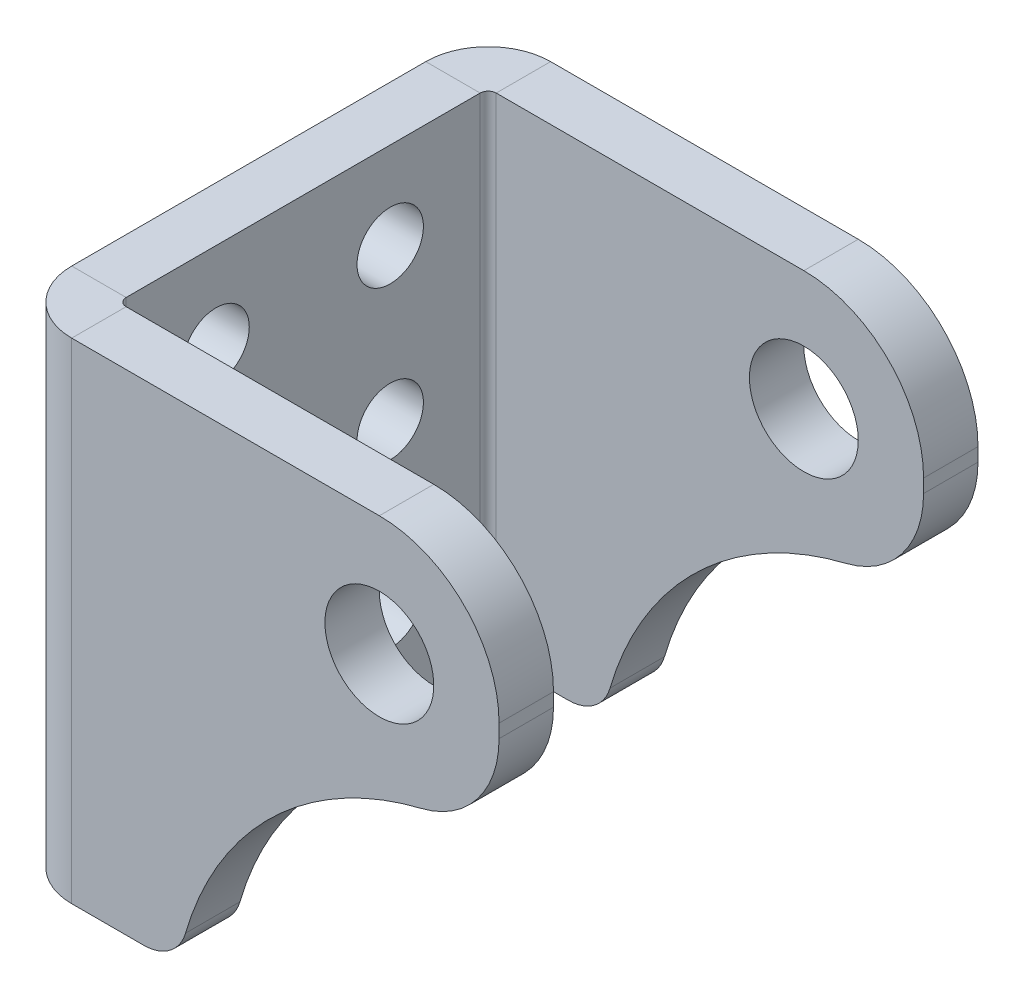
ISO-10303-21;
HEADER;
FILE_DESCRIPTION(('STEP AP214'),'2;1');
FILE_NAME('part.step','',(''),(''),'','','');
FILE_SCHEMA(('AUTOMOTIVE_DESIGN { 1 0 10303 214 1 1 1 1 }'));
ENDSEC;
DATA;
#1=APPLICATION_CONTEXT('core data for automotive mechanical design processes');
#2=APPLICATION_PROTOCOL_DEFINITION('international standard','automotive_design',2000,#1);
#3=PRODUCT_CONTEXT('',#1,'mechanical');
#4=PRODUCT('Part','Part','',(#3));
#5=PRODUCT_RELATED_PRODUCT_CATEGORY('part','',(#4));
#6=PRODUCT_DEFINITION_FORMATION('','',#4);
#7=PRODUCT_DEFINITION_CONTEXT('part definition',#1,'design');
#8=PRODUCT_DEFINITION('design','',#6,#7);
#9=PRODUCT_DEFINITION_SHAPE('','',#8);
#10=(LENGTH_UNIT() NAMED_UNIT(*) SI_UNIT(.MILLI.,.METRE.));
#11=(NAMED_UNIT(*) PLANE_ANGLE_UNIT() SI_UNIT($,.RADIAN.));
#12=(NAMED_UNIT(*) SI_UNIT($,.STERADIAN.) SOLID_ANGLE_UNIT());
#13=UNCERTAINTY_MEASURE_WITH_UNIT(LENGTH_MEASURE(1.E-05),#10,'distance_accuracy_value','');
#14=(GEOMETRIC_REPRESENTATION_CONTEXT(3) GLOBAL_UNCERTAINTY_ASSIGNED_CONTEXT((#13)) GLOBAL_UNIT_ASSIGNED_CONTEXT((#10,
#11,#12)) REPRESENTATION_CONTEXT('',''));
#15=CARTESIAN_POINT('',(0.,0.,0.));
#16=DIRECTION('',(0.,0.,1.));
#17=DIRECTION('',(1.,0.,0.));
#18=AXIS2_PLACEMENT_3D('',#15,#16,#17);
#19=CARTESIAN_POINT('',(-5.,0.,0.));
#20=DIRECTION('',(-1.,0.,0.));
#21=DIRECTION('',(0.,0.,1.));
#22=AXIS2_PLACEMENT_3D('',#19,#20,#21);
#23=PLANE('',#22);
#24=CARTESIAN_POINT('',(-5.,37.,-30.));
#25=DIRECTION('',(1.,0.,0.));
#26=DIRECTION('',(0.,0.,-1.));
#27=AXIS2_PLACEMENT_3D('',#24,#25,#26);
#28=CIRCLE('',#27,3.05);
#29=CARTESIAN_POINT('',(-5.,37.,-33.05));
#30=VERTEX_POINT('',#29);
#31=EDGE_CURVE('E377',#30,#30,#28,.T.);
#32=ORIENTED_EDGE('',*,*,#31,.T.);
#33=EDGE_LOOP('',(#32));
#34=FACE_BOUND('',#33,.T.);
#35=CARTESIAN_POINT('',(-5.,23.,-30.));
#36=DIRECTION('',(1.,0.,0.));
#37=DIRECTION('',(0.,0.,-1.));
#38=AXIS2_PLACEMENT_3D('',#35,#36,#37);
#39=CIRCLE('',#38,3.05);
#40=CARTESIAN_POINT('',(-5.,23.,-33.05));
#41=VERTEX_POINT('',#40);
#42=EDGE_CURVE('E382',#41,#41,#39,.T.);
#43=ORIENTED_EDGE('',*,*,#42,.T.);
#44=EDGE_LOOP('',(#43));
#45=FACE_BOUND('',#44,.T.);
#46=CARTESIAN_POINT('',(-5.,8.,-30.));
#47=DIRECTION('',(1.,0.,0.));
#48=DIRECTION('',(0.,0.,-1.));
#49=AXIS2_PLACEMENT_3D('',#46,#47,#48);
#50=CIRCLE('',#49,3.05000000000001);
#51=CARTESIAN_POINT('',(-5.,8.,-33.05));
#52=VERTEX_POINT('',#51);
#53=EDGE_CURVE('E392',#52,#52,#50,.T.);
#54=ORIENTED_EDGE('',*,*,#53,.T.);
#55=EDGE_LOOP('',(#54));
#56=FACE_BOUND('',#55,.T.);
#57=CARTESIAN_POINT('',(-5.,8.,-14.));
#58=DIRECTION('',(1.,0.,0.));
#59=DIRECTION('',(0.,0.,-1.));
#60=AXIS2_PLACEMENT_3D('',#57,#58,#59);
#61=CIRCLE('',#60,3.05);
#62=CARTESIAN_POINT('',(-5.,8.,-17.05));
#63=VERTEX_POINT('',#62);
#64=EDGE_CURVE('E397',#63,#63,#61,.T.);
#65=ORIENTED_EDGE('',*,*,#64,.T.);
#66=EDGE_LOOP('',(#65));
#67=FACE_BOUND('',#66,.T.);
#68=CARTESIAN_POINT('',(-5.,23.,-14.));
#69=DIRECTION('',(1.,0.,0.));
#70=DIRECTION('',(0.,0.,-1.));
#71=AXIS2_PLACEMENT_3D('',#68,#69,#70);
#72=CIRCLE('',#71,3.05000000000001);
#73=CARTESIAN_POINT('',(-5.,23.,-17.05));
#74=VERTEX_POINT('',#73);
#75=EDGE_CURVE('E408',#74,#74,#72,.T.);
#76=ORIENTED_EDGE('',*,*,#75,.T.);
#77=EDGE_LOOP('',(#76));
#78=FACE_BOUND('',#77,.T.);
#79=CARTESIAN_POINT('',(-5.,37.,-14.));
#80=DIRECTION('',(1.,0.,0.));
#81=DIRECTION('',(0.,0.,-1.));
#82=AXIS2_PLACEMENT_3D('',#79,#80,#81);
#83=CIRCLE('',#82,3.05000000000001);
#84=CARTESIAN_POINT('',(-5.,37.,-17.05));
#85=VERTEX_POINT('',#84);
#86=EDGE_CURVE('E417',#85,#85,#83,.T.);
#87=ORIENTED_EDGE('',*,*,#86,.T.);
#88=EDGE_LOOP('',(#87));
#89=FACE_BOUND('',#88,.T.);
#90=DIRECTION('',(0.,0.,1.));
#91=VECTOR('',#90,1.);
#92=CARTESIAN_POINT('',(-5.,45.,-44.));
#93=LINE('',#92,#91);
#94=CARTESIAN_POINT('',(-5.00000000000001,45.,-38.2634));
#95=VERTEX_POINT('',#94);
#96=CARTESIAN_POINT('',(-5.,45.,-5.7366));
#97=VERTEX_POINT('',#96);
#98=EDGE_CURVE('E428',#95,#97,#93,.T.);
#99=ORIENTED_EDGE('',*,*,#98,.F.);
#100=DIRECTION('',(0.,1.,0.));
#101=VECTOR('',#100,1.);
#102=CARTESIAN_POINT('',(-5.00000000000001,45.,-38.2634));
#103=LINE('',#102,#101);
#104=CARTESIAN_POINT('',(-5.,0.,-38.2634));
#105=VERTEX_POINT('',#104);
#106=EDGE_CURVE('E231',#95,#105,#103,.F.);
#107=ORIENTED_EDGE('',*,*,#106,.T.);
#108=DIRECTION('',(0.,0.,-1.));
#109=VECTOR('',#108,1.);
#110=CARTESIAN_POINT('',(-5.,0.,-44.));
#111=LINE('',#110,#109);
#112=CARTESIAN_POINT('',(-5.,0.,-5.7366));
#113=VERTEX_POINT('',#112);
#114=EDGE_CURVE('E421',#113,#105,#111,.T.);
#115=ORIENTED_EDGE('',*,*,#114,.F.);
#116=DIRECTION('',(0.,-1.,0.));
#117=VECTOR('',#116,1.);
#118=CARTESIAN_POINT('',(-5.,0.,-5.7366));
#119=LINE('',#118,#117);
#120=EDGE_CURVE('E344',#113,#97,#119,.F.);
#121=ORIENTED_EDGE('',*,*,#120,.T.);
#122=EDGE_LOOP('',(#99,#107,#115,#121));
#123=FACE_BOUND('',#122,.T.);
#124=ADVANCED_FACE('F86',(#34,#45,#56,#67,#78,#89,#123),#23,.T.);
#125=CARTESIAN_POINT('',(0.,0.,0.));
#126=DIRECTION('',(-1.,0.,0.));
#127=DIRECTION('',(0.,0.,1.));
#128=AXIS2_PLACEMENT_3D('',#125,#126,#127);
#129=PLANE('',#128);
#130=CARTESIAN_POINT('',(0.,37.,-30.));
#131=DIRECTION('',(1.,0.,0.));
#132=DIRECTION('',(0.,0.,-1.));
#133=AXIS2_PLACEMENT_3D('',#130,#131,#132);
#134=CIRCLE('',#133,3.05);
#135=CARTESIAN_POINT('',(0.,37.,-33.05));
#136=VERTEX_POINT('',#135);
#137=EDGE_CURVE('E374',#136,#136,#134,.T.);
#138=ORIENTED_EDGE('',*,*,#137,.F.);
#139=EDGE_LOOP('',(#138));
#140=FACE_BOUND('',#139,.T.);
#141=CARTESIAN_POINT('',(0.,23.,-30.));
#142=DIRECTION('',(1.,0.,0.));
#143=DIRECTION('',(0.,0.,-1.));
#144=AXIS2_PLACEMENT_3D('',#141,#142,#143);
#145=CIRCLE('',#144,3.05);
#146=CARTESIAN_POINT('',(0.,23.,-33.05));
#147=VERTEX_POINT('',#146);
#148=EDGE_CURVE('E378',#147,#147,#145,.T.);
#149=ORIENTED_EDGE('',*,*,#148,.F.);
#150=EDGE_LOOP('',(#149));
#151=FACE_BOUND('',#150,.T.);
#152=CARTESIAN_POINT('',(0.,8.,-30.));
#153=DIRECTION('',(1.,0.,0.));
#154=DIRECTION('',(0.,0.,-1.));
#155=AXIS2_PLACEMENT_3D('',#152,#153,#154);
#156=CIRCLE('',#155,3.05000000000001);
#157=CARTESIAN_POINT('',(0.,8.,-33.05));
#158=VERTEX_POINT('',#157);
#159=EDGE_CURVE('E390',#158,#158,#156,.T.);
#160=ORIENTED_EDGE('',*,*,#159,.F.);
#161=EDGE_LOOP('',(#160));
#162=FACE_BOUND('',#161,.T.);
#163=CARTESIAN_POINT('',(0.,8.,-14.));
#164=DIRECTION('',(1.,0.,0.));
#165=DIRECTION('',(0.,0.,-1.));
#166=AXIS2_PLACEMENT_3D('',#163,#164,#165);
#167=CIRCLE('',#166,3.05);
#168=CARTESIAN_POINT('',(0.,8.,-17.05));
#169=VERTEX_POINT('',#168);
#170=EDGE_CURVE('E398',#169,#169,#167,.T.);
#171=ORIENTED_EDGE('',*,*,#170,.F.);
#172=EDGE_LOOP('',(#171));
#173=FACE_BOUND('',#172,.T.);
#174=CARTESIAN_POINT('',(0.,23.,-14.));
#175=DIRECTION('',(1.,0.,0.));
#176=DIRECTION('',(0.,0.,-1.));
#177=AXIS2_PLACEMENT_3D('',#174,#175,#176);
#178=CIRCLE('',#177,3.05000000000001);
#179=CARTESIAN_POINT('',(0.,23.,-17.05));
#180=VERTEX_POINT('',#179);
#181=EDGE_CURVE('E402',#180,#180,#178,.T.);
#182=ORIENTED_EDGE('',*,*,#181,.F.);
#183=EDGE_LOOP('',(#182));
#184=FACE_BOUND('',#183,.T.);
#185=CARTESIAN_POINT('',(0.,37.,-14.));
#186=DIRECTION('',(1.,0.,0.));
#187=DIRECTION('',(0.,0.,-1.));
#188=AXIS2_PLACEMENT_3D('',#185,#186,#187);
#189=CIRCLE('',#188,3.05000000000001);
#190=CARTESIAN_POINT('',(0.,37.,-17.05));
#191=VERTEX_POINT('',#190);
#192=EDGE_CURVE('E415',#191,#191,#189,.T.);
#193=ORIENTED_EDGE('',*,*,#192,.F.);
#194=EDGE_LOOP('',(#193));
#195=FACE_BOUND('',#194,.T.);
#196=DIRECTION('',(0.,1.,0.));
#197=VECTOR('',#196,1.);
#198=CARTESIAN_POINT('',(0.,45.,-38.2634));
#199=LINE('',#198,#197);
#200=CARTESIAN_POINT('',(0.,45.,-38.2634));
#201=VERTEX_POINT('',#200);
#202=CARTESIAN_POINT('',(0.,0.,-38.2634));
#203=VERTEX_POINT('',#202);
#204=EDGE_CURVE('E299',#201,#203,#199,.F.);
#205=ORIENTED_EDGE('',*,*,#204,.F.);
#206=DIRECTION('',(0.,0.,1.));
#207=VECTOR('',#206,1.);
#208=CARTESIAN_POINT('',(0.,45.,-44.));
#209=LINE('',#208,#207);
#210=CARTESIAN_POINT('',(0.,45.,-5.7366));
#211=VERTEX_POINT('',#210);
#212=EDGE_CURVE('E427',#201,#211,#209,.T.);
#213=ORIENTED_EDGE('',*,*,#212,.T.);
#214=DIRECTION('',(0.,-1.,0.));
#215=VECTOR('',#214,1.);
#216=CARTESIAN_POINT('',(0.,0.,-5.7366));
#217=LINE('',#216,#215);
#218=CARTESIAN_POINT('',(0.,0.,-5.7366));
#219=VERTEX_POINT('',#218);
#220=EDGE_CURVE('E365',#219,#211,#217,.F.);
#221=ORIENTED_EDGE('',*,*,#220,.F.);
#222=DIRECTION('',(0.,0.,-1.));
#223=VECTOR('',#222,1.);
#224=CARTESIAN_POINT('',(0.,0.,-44.));
#225=LINE('',#224,#223);
#226=EDGE_CURVE('E418',#219,#203,#225,.T.);
#227=ORIENTED_EDGE('',*,*,#226,.T.);
#228=EDGE_LOOP('',(#205,#213,#221,#227));
#229=FACE_BOUND('',#228,.T.);
#230=ADVANCED_FACE('F545',(#140,#151,#162,#173,#184,#195,#229),#129,.F.);
#231=CARTESIAN_POINT('',(-5.,45.,-44.));
#232=DIRECTION('',(0.,1.,0.));
#233=DIRECTION('',(0.,0.,1.));
#234=AXIS2_PLACEMENT_3D('',#231,#232,#233);
#235=PLANE('',#234);
#236=ORIENTED_EDGE('',*,*,#212,.F.);
#237=DIRECTION('',(-1.,0.,0.));
#238=VECTOR('',#237,1.);
#239=CARTESIAN_POINT('',(0.,45.,-38.2634));
#240=LINE('',#239,#238);
#241=EDGE_CURVE('E292',#201,#95,#240,.T.);
#242=ORIENTED_EDGE('',*,*,#241,.T.);
#243=ORIENTED_EDGE('',*,*,#98,.T.);
#244=DIRECTION('',(-1.,0.,0.));
#245=VECTOR('',#244,1.);
#246=CARTESIAN_POINT('',(0.,45.,-5.7366));
#247=LINE('',#246,#245);
#248=EDGE_CURVE('E368',#211,#97,#247,.T.);
#249=ORIENTED_EDGE('',*,*,#248,.F.);
#250=EDGE_LOOP('',(#236,#242,#243,#249));
#251=FACE_BOUND('',#250,.T.);
#252=ADVANCED_FACE('F581',(#251),#235,.T.);
#253=CARTESIAN_POINT('',(-5.,0.,-44.));
#254=DIRECTION('',(0.,-1.,0.));
#255=DIRECTION('',(0.,0.,-1.));
#256=AXIS2_PLACEMENT_3D('',#253,#254,#255);
#257=PLANE('',#256);
#258=DIRECTION('',(-1.,0.,0.));
#259=VECTOR('',#258,1.);
#260=CARTESIAN_POINT('',(0.,0.,-38.2634));
#261=LINE('',#260,#259);
#262=EDGE_CURVE('E304',#203,#105,#261,.T.);
#263=ORIENTED_EDGE('',*,*,#262,.F.);
#264=ORIENTED_EDGE('',*,*,#226,.F.);
#265=DIRECTION('',(-1.,0.,0.));
#266=VECTOR('',#265,1.);
#267=CARTESIAN_POINT('',(0.,0.,-5.7366));
#268=LINE('',#267,#266);
#269=EDGE_CURVE('E353',#219,#113,#268,.T.);
#270=ORIENTED_EDGE('',*,*,#269,.T.);
#271=ORIENTED_EDGE('',*,*,#114,.T.);
#272=EDGE_LOOP('',(#263,#264,#270,#271));
#273=FACE_BOUND('',#272,.T.);
#274=ADVANCED_FACE('F539',(#273),#257,.T.);
#275=CARTESIAN_POINT('',(-5.,37.,-14.));
#276=DIRECTION('',(1.,0.,0.));
#277=DIRECTION('',(0.,0.,-1.));
#278=AXIS2_PLACEMENT_3D('',#275,#276,#277);
#279=CYLINDRICAL_SURFACE('',#278,3.05000000000001);
#280=ORIENTED_EDGE('',*,*,#86,.F.);
#281=EDGE_LOOP('',(#280));
#282=FACE_BOUND('',#281,.T.);
#283=ORIENTED_EDGE('',*,*,#192,.T.);
#284=EDGE_LOOP('',(#283));
#285=FACE_BOUND('',#284,.T.);
#286=ADVANCED_FACE('F588',(#282,#285),#279,.F.);
#287=CARTESIAN_POINT('',(-5.,23.,-14.));
#288=DIRECTION('',(1.,0.,0.));
#289=DIRECTION('',(0.,0.,-1.));
#290=AXIS2_PLACEMENT_3D('',#287,#288,#289);
#291=CYLINDRICAL_SURFACE('',#290,3.05000000000001);
#292=ORIENTED_EDGE('',*,*,#75,.F.);
#293=EDGE_LOOP('',(#292));
#294=FACE_BOUND('',#293,.T.);
#295=ORIENTED_EDGE('',*,*,#181,.T.);
#296=EDGE_LOOP('',(#295));
#297=FACE_BOUND('',#296,.T.);
#298=ADVANCED_FACE('F605',(#294,#297),#291,.F.);
#299=CARTESIAN_POINT('',(-5.,8.,-14.));
#300=DIRECTION('',(1.,0.,0.));
#301=DIRECTION('',(0.,0.,-1.));
#302=AXIS2_PLACEMENT_3D('',#299,#300,#301);
#303=CYLINDRICAL_SURFACE('',#302,3.05);
#304=ORIENTED_EDGE('',*,*,#64,.F.);
#305=EDGE_LOOP('',(#304));
#306=FACE_BOUND('',#305,.T.);
#307=ORIENTED_EDGE('',*,*,#170,.T.);
#308=EDGE_LOOP('',(#307));
#309=FACE_BOUND('',#308,.T.);
#310=ADVANCED_FACE('F606',(#306,#309),#303,.F.);
#311=CARTESIAN_POINT('',(-5.,8.,-30.));
#312=DIRECTION('',(1.,0.,0.));
#313=DIRECTION('',(0.,0.,-1.));
#314=AXIS2_PLACEMENT_3D('',#311,#312,#313);
#315=CYLINDRICAL_SURFACE('',#314,3.05000000000001);
#316=ORIENTED_EDGE('',*,*,#53,.F.);
#317=EDGE_LOOP('',(#316));
#318=FACE_BOUND('',#317,.T.);
#319=ORIENTED_EDGE('',*,*,#159,.T.);
#320=EDGE_LOOP('',(#319));
#321=FACE_BOUND('',#320,.T.);
#322=ADVANCED_FACE('F609',(#318,#321),#315,.F.);
#323=CARTESIAN_POINT('',(-5.,23.,-30.));
#324=DIRECTION('',(1.,0.,0.));
#325=DIRECTION('',(0.,0.,-1.));
#326=AXIS2_PLACEMENT_3D('',#323,#324,#325);
#327=CYLINDRICAL_SURFACE('',#326,3.05);
#328=ORIENTED_EDGE('',*,*,#42,.F.);
#329=EDGE_LOOP('',(#328));
#330=FACE_BOUND('',#329,.T.);
#331=ORIENTED_EDGE('',*,*,#148,.T.);
#332=EDGE_LOOP('',(#331));
#333=FACE_BOUND('',#332,.T.);
#334=ADVANCED_FACE('F615',(#330,#333),#327,.F.);
#335=CARTESIAN_POINT('',(-5.,37.,-30.));
#336=DIRECTION('',(1.,0.,0.));
#337=DIRECTION('',(0.,0.,-1.));
#338=AXIS2_PLACEMENT_3D('',#335,#336,#337);
#339=CYLINDRICAL_SURFACE('',#338,3.05);
#340=ORIENTED_EDGE('',*,*,#31,.F.);
#341=EDGE_LOOP('',(#340));
#342=FACE_BOUND('',#341,.T.);
#343=ORIENTED_EDGE('',*,*,#137,.T.);
#344=EDGE_LOOP('',(#343));
#345=FACE_BOUND('',#344,.T.);
#346=ADVANCED_FACE('F616',(#342,#345),#339,.F.);
#347=CARTESIAN_POINT('',(0.736599999999997,45.,-5.7366));
#348=DIRECTION('',(0.,1.,0.));
#349=DIRECTION('',(0.,0.,1.));
#350=AXIS2_PLACEMENT_3D('',#347,#348,#349);
#351=PLANE('',#350);
#352=DIRECTION('',(0.,0.,-1.));
#353=VECTOR('',#352,1.);
#354=CARTESIAN_POINT('',(0.736599999999997,45.,0.));
#355=LINE('',#354,#353);
#356=CARTESIAN_POINT('',(0.736599999999995,45.,-5.));
#357=VERTEX_POINT('',#356);
#358=CARTESIAN_POINT('',(0.736599999999977,45.,0.));
#359=VERTEX_POINT('',#358);
#360=EDGE_CURVE('E310',#357,#359,#355,.F.);
#361=ORIENTED_EDGE('',*,*,#360,.F.);
#362=CARTESIAN_POINT('',(0.736599999999997,45.,-5.7366));
#363=DIRECTION('',(0.,-1.,0.));
#364=DIRECTION('',(0.,0.,-1.));
#365=AXIS2_PLACEMENT_3D('',#362,#363,#364);
#366=CIRCLE('',#365,0.7366);
#367=EDGE_CURVE('E359',#211,#357,#366,.F.);
#368=ORIENTED_EDGE('',*,*,#367,.F.);
#369=ORIENTED_EDGE('',*,*,#248,.T.);
#370=CARTESIAN_POINT('',(0.736599999999997,45.,-5.7366));
#371=DIRECTION('',(0.,-1.,0.));
#372=DIRECTION('',(0.,0.,-1.));
#373=AXIS2_PLACEMENT_3D('',#370,#371,#372);
#374=CIRCLE('',#373,5.7366);
#375=EDGE_CURVE('E347',#97,#359,#374,.F.);
#376=ORIENTED_EDGE('',*,*,#375,.T.);
#377=EDGE_LOOP('',(#361,#368,#369,#376));
#378=FACE_BOUND('',#377,.T.);
#379=ADVANCED_FACE('F554',(#378),#351,.T.);
#380=CARTESIAN_POINT('',(0.736599999999997,0.,-5.7366));
#381=DIRECTION('',(0.,1.,0.));
#382=DIRECTION('',(0.,0.,1.));
#383=AXIS2_PLACEMENT_3D('',#380,#381,#382);
#384=PLANE('',#383);
#385=CARTESIAN_POINT('',(0.736599999999997,0.,-5.7366));
#386=DIRECTION('',(0.,-1.,0.));
#387=DIRECTION('',(0.,0.,-1.));
#388=AXIS2_PLACEMENT_3D('',#385,#386,#387);
#389=CIRCLE('',#388,0.7366);
#390=CARTESIAN_POINT('',(0.736599999999995,0.,-5.));
#391=VERTEX_POINT('',#390);
#392=EDGE_CURVE('E312',#391,#219,#389,.T.);
#393=ORIENTED_EDGE('',*,*,#392,.F.);
#394=DIRECTION('',(0.,0.,-1.));
#395=VECTOR('',#394,1.);
#396=CARTESIAN_POINT('',(0.736599999999997,0.,-5.));
#397=LINE('',#396,#395);
#398=CARTESIAN_POINT('',(0.736599999999997,0.,0.));
#399=VERTEX_POINT('',#398);
#400=EDGE_CURVE('E334',#391,#399,#397,.F.);
#401=ORIENTED_EDGE('',*,*,#400,.T.);
#402=CARTESIAN_POINT('',(0.736599999999997,0.,-5.7366));
#403=DIRECTION('',(0.,-1.,0.));
#404=DIRECTION('',(0.,0.,-1.));
#405=AXIS2_PLACEMENT_3D('',#402,#403,#404);
#406=CIRCLE('',#405,5.7366);
#407=EDGE_CURVE('E349',#399,#113,#406,.T.);
#408=ORIENTED_EDGE('',*,*,#407,.T.);
#409=ORIENTED_EDGE('',*,*,#269,.F.);
#410=EDGE_LOOP('',(#393,#401,#408,#409));
#411=FACE_BOUND('',#410,.T.);
#412=ADVANCED_FACE('F566',(#411),#384,.F.);
#413=CARTESIAN_POINT('',(0.736599999999997,0.,-5.7366));
#414=DIRECTION('',(0.,-1.,0.));
#415=DIRECTION('',(0.,0.,1.));
#416=AXIS2_PLACEMENT_3D('',#413,#414,#415);
#417=CYLINDRICAL_SURFACE('',#416,5.7366);
#418=ORIENTED_EDGE('',*,*,#120,.F.);
#419=ORIENTED_EDGE('',*,*,#407,.F.);
#420=DIRECTION('',(0.,-1.,0.));
#421=VECTOR('',#420,1.);
#422=CARTESIAN_POINT('',(0.736599999999997,45.,0.));
#423=LINE('',#422,#421);
#424=EDGE_CURVE('E333',#399,#359,#423,.F.);
#425=ORIENTED_EDGE('',*,*,#424,.T.);
#426=ORIENTED_EDGE('',*,*,#375,.F.);
#427=EDGE_LOOP('',(#418,#419,#425,#426));
#428=FACE_BOUND('',#427,.T.);
#429=ADVANCED_FACE('F580',(#428),#417,.T.);
#430=CARTESIAN_POINT('',(0.736599999999997,0.,-5.7366));
#431=DIRECTION('',(0.,-1.,0.));
#432=DIRECTION('',(0.,0.,1.));
#433=AXIS2_PLACEMENT_3D('',#430,#431,#432);
#434=CYLINDRICAL_SURFACE('',#433,0.7366);
#435=ORIENTED_EDGE('',*,*,#220,.T.);
#436=ORIENTED_EDGE('',*,*,#367,.T.);
#437=DIRECTION('',(0.,-1.,0.));
#438=VECTOR('',#437,1.);
#439=CARTESIAN_POINT('',(0.736599999999997,45.,-5.));
#440=LINE('',#439,#438);
#441=EDGE_CURVE('E339',#357,#391,#440,.T.);
#442=ORIENTED_EDGE('',*,*,#441,.T.);
#443=ORIENTED_EDGE('',*,*,#392,.T.);
#444=EDGE_LOOP('',(#435,#436,#442,#443));
#445=FACE_BOUND('',#444,.T.);
#446=ADVANCED_FACE('F550',(#445),#434,.F.);
#447=CARTESIAN_POINT('',(0.,45.,0.));
#448=DIRECTION('',(0.,-1.,0.));
#449=DIRECTION('',(0.,0.,-1.));
#450=AXIS2_PLACEMENT_3D('',#447,#448,#449);
#451=PLANE('',#450);
#452=DIRECTION('',(-1.,0.,0.));
#453=VECTOR('',#452,1.);
#454=CARTESIAN_POINT('',(0.,45.,0.));
#455=LINE('',#454,#453);
#456=CARTESIAN_POINT('',(29.,45.,1.01252958826451E-13));
#457=VERTEX_POINT('',#456);
#458=EDGE_CURVE('E316',#457,#359,#455,.T.);
#459=ORIENTED_EDGE('',*,*,#458,.F.);
#460=DIRECTION('',(0.,0.,-1.));
#461=VECTOR('',#460,1.);
#462=CARTESIAN_POINT('',(29.,45.,1.01252958826451E-13));
#463=LINE('',#462,#461);
#464=CARTESIAN_POINT('',(29.,45.,-4.9999999999999));
#465=VERTEX_POINT('',#464);
#466=EDGE_CURVE('E432',#457,#465,#463,.T.);
#467=ORIENTED_EDGE('',*,*,#466,.T.);
#468=DIRECTION('',(1.,0.,0.));
#469=VECTOR('',#468,1.);
#470=CARTESIAN_POINT('',(0.,45.,-5.));
#471=LINE('',#470,#469);
#472=EDGE_CURVE('E330',#465,#357,#471,.F.);
#473=ORIENTED_EDGE('',*,*,#472,.T.);
#474=ORIENTED_EDGE('',*,*,#360,.T.);
#475=EDGE_LOOP('',(#459,#467,#473,#474));
#476=FACE_BOUND('',#475,.T.);
#477=ADVANCED_FACE('F551',(#476),#451,.F.);
#478=CARTESIAN_POINT('',(40.,0.,1.39645239816133E-13));
#479=DIRECTION('',(0.,1.,0.));
#480=DIRECTION('',(0.,0.,1.));
#481=AXIS2_PLACEMENT_3D('',#478,#479,#480);
#482=PLANE('',#481);
#483=DIRECTION('',(-1.,0.,0.));
#484=VECTOR('',#483,1.);
#485=CARTESIAN_POINT('',(40.,0.,-4.99999999999986));
#486=LINE('',#485,#484);
#487=CARTESIAN_POINT('',(7.35325255135252,0.,-4.99999999999997));
#488=VERTEX_POINT('',#487);
#489=EDGE_CURVE('E322',#391,#488,#486,.F.);
#490=ORIENTED_EDGE('',*,*,#489,.T.);
#491=DIRECTION('',(0.,0.,-1.));
#492=VECTOR('',#491,1.);
#493=CARTESIAN_POINT('',(7.35325255135253,0.,2.52911398243042E-13));
#494=LINE('',#493,#492);
#495=CARTESIAN_POINT('',(7.35325255135253,0.,0.));
#496=VERTEX_POINT('',#495);
#497=EDGE_CURVE('E503',#488,#496,#494,.F.);
#498=ORIENTED_EDGE('',*,*,#497,.T.);
#499=DIRECTION('',(1.,0.,0.));
#500=VECTOR('',#499,1.);
#501=CARTESIAN_POINT('',(0.,0.,0.));
#502=LINE('',#501,#500);
#503=EDGE_CURVE('E315',#399,#496,#502,.T.);
#504=ORIENTED_EDGE('',*,*,#503,.F.);
#505=ORIENTED_EDGE('',*,*,#400,.F.);
#506=EDGE_LOOP('',(#490,#498,#504,#505));
#507=FACE_BOUND('',#506,.T.);
#508=ADVANCED_FACE('F573',(#507),#482,.F.);
#509=CARTESIAN_POINT('',(0.,0.,0.));
#510=DIRECTION('',(0.,0.,-1.));
#511=DIRECTION('',(-1.,0.,0.));
#512=AXIS2_PLACEMENT_3D('',#509,#510,#511);
#513=PLANE('',#512);
#514=CARTESIAN_POINT('',(29.0000000000001,34.,1.04083408558608E-13));
#515=DIRECTION('',(0.,0.,-1.));
#516=DIRECTION('',(-1.,0.,0.));
#517=AXIS2_PLACEMENT_3D('',#514,#515,#516);
#518=CIRCLE('',#517,5.);
#519=CARTESIAN_POINT('',(24.0000000000001,34.,0.));
#520=VERTEX_POINT('',#519);
#521=EDGE_CURVE('E288',#520,#520,#518,.T.);
#522=ORIENTED_EDGE('',*,*,#521,.T.);
#523=EDGE_LOOP('',(#522));
#524=FACE_BOUND('',#523,.T.);
#525=ORIENTED_EDGE('',*,*,#503,.T.);
#526=CARTESIAN_POINT('',(7.35325255135253,4.,0.));
#527=DIRECTION('',(0.,0.,-1.));
#528=DIRECTION('',(-1.,0.,0.));
#529=AXIS2_PLACEMENT_3D('',#526,#527,#528);
#530=CIRCLE('',#529,4.);
#531=CARTESIAN_POINT('',(11.1940463688405,2.88272525691023,0.));
#532=VERTEX_POINT('',#531);
#533=EDGE_CURVE('E504',#496,#532,#530,.F.);
#534=ORIENTED_EDGE('',*,*,#533,.T.);
#535=CARTESIAN_POINT('',(40.0000000000001,-5.49683531626301,1.38777878078145E-13));
#536=DIRECTION('',(0.,0.,-1.));
#537=DIRECTION('',(-1.,0.,0.));
#538=AXIS2_PLACEMENT_3D('',#535,#536,#537);
#539=CIRCLE('',#538,30.);
#540=CARTESIAN_POINT('',(32.8426395939084,23.6368598152734,1.137880877849E-13));
#541=VERTEX_POINT('',#540);
#542=EDGE_CURVE('E681',#532,#541,#539,.T.);
#543=ORIENTED_EDGE('',*,*,#542,.T.);
#544=CARTESIAN_POINT('',(30.5999999999996,32.7654176231548,1.04083408558608E-13));
#545=DIRECTION('',(0.,0.,-1.));
#546=DIRECTION('',(-1.,0.,0.));
#547=AXIS2_PLACEMENT_3D('',#544,#545,#546);
#548=CIRCLE('',#547,9.4);
#549=CARTESIAN_POINT('',(40.,32.7654176231548,1.39659253553725E-13));
#550=VERTEX_POINT('',#549);
#551=EDGE_CURVE('E496',#541,#550,#548,.F.);
#552=ORIENTED_EDGE('',*,*,#551,.T.);
#553=DIRECTION('',(0.,1.,0.));
#554=VECTOR('',#553,1.);
#555=CARTESIAN_POINT('',(40.,0.,1.39659253553725E-13));
#556=LINE('',#555,#554);
#557=CARTESIAN_POINT('',(40.,34.,1.39659253553725E-13));
#558=VERTEX_POINT('',#557);
#559=EDGE_CURVE('E309',#550,#558,#556,.T.);
#560=ORIENTED_EDGE('',*,*,#559,.T.);
#561=CARTESIAN_POINT('',(29.,34.,1.01252958826451E-13));
#562=DIRECTION('',(0.,0.,-1.));
#563=DIRECTION('',(-1.,0.,0.));
#564=AXIS2_PLACEMENT_3D('',#561,#562,#563);
#565=CIRCLE('',#564,11.);
#566=EDGE_CURVE('E460',#558,#457,#565,.F.);
#567=ORIENTED_EDGE('',*,*,#566,.T.);
#568=ORIENTED_EDGE('',*,*,#458,.T.);
#569=ORIENTED_EDGE('',*,*,#424,.F.);
#570=EDGE_LOOP('',(#525,#534,#543,#552,#560,#567,#568,#569));
#571=FACE_BOUND('',#570,.T.);
#572=ADVANCED_FACE('F575',(#524,#571),#513,.F.);
#573=CARTESIAN_POINT('',(0.,0.,-5.));
#574=DIRECTION('',(0.,0.,-1.));
#575=DIRECTION('',(-1.,0.,0.));
#576=AXIS2_PLACEMENT_3D('',#573,#574,#575);
#577=PLANE('',#576);
#578=CARTESIAN_POINT('',(40.0000000000001,-5.49683531626301,-4.99999999999986));
#579=DIRECTION('',(0.,0.,-1.));
#580=DIRECTION('',(-1.,0.,0.));
#581=AXIS2_PLACEMENT_3D('',#578,#579,#580);
#582=CIRCLE('',#581,30.);
#583=CARTESIAN_POINT('',(11.1940463688405,2.88272525691023,-4.99999999999996));
#584=VERTEX_POINT('',#583);
#585=CARTESIAN_POINT('',(32.8426395939083,23.6368598152734,-4.99999999999988));
#586=VERTEX_POINT('',#585);
#587=EDGE_CURVE('E690',#584,#586,#582,.T.);
#588=ORIENTED_EDGE('',*,*,#587,.F.);
#589=CARTESIAN_POINT('',(7.35325255135251,4.,-4.99999999999997));
#590=DIRECTION('',(0.,0.,-1.));
#591=DIRECTION('',(-1.,0.,0.));
#592=AXIS2_PLACEMENT_3D('',#589,#590,#591);
#593=CIRCLE('',#592,4.);
#594=EDGE_CURVE('E513',#584,#488,#593,.T.);
#595=ORIENTED_EDGE('',*,*,#594,.T.);
#596=ORIENTED_EDGE('',*,*,#489,.F.);
#597=ORIENTED_EDGE('',*,*,#441,.F.);
#598=ORIENTED_EDGE('',*,*,#472,.F.);
#599=CARTESIAN_POINT('',(29.,34.,-4.9999999999999));
#600=DIRECTION('',(0.,0.,-1.));
#601=DIRECTION('',(-1.,0.,0.));
#602=AXIS2_PLACEMENT_3D('',#599,#600,#601);
#603=CIRCLE('',#602,11.);
#604=CARTESIAN_POINT('',(40.,34.,-4.99999999999986));
#605=VERTEX_POINT('',#604);
#606=EDGE_CURVE('E448',#465,#605,#603,.T.);
#607=ORIENTED_EDGE('',*,*,#606,.T.);
#608=DIRECTION('',(0.,-1.,0.));
#609=VECTOR('',#608,1.);
#610=CARTESIAN_POINT('',(40.,45.,-4.99999999999986));
#611=LINE('',#610,#609);
#612=CARTESIAN_POINT('',(40.,32.7654176231548,-4.99999999999986));
#613=VERTEX_POINT('',#612);
#614=EDGE_CURVE('E323',#613,#605,#611,.F.);
#615=ORIENTED_EDGE('',*,*,#614,.F.);
#616=CARTESIAN_POINT('',(30.5999999999996,32.7654176231548,-4.99999999999989));
#617=DIRECTION('',(0.,0.,-1.));
#618=DIRECTION('',(-1.,0.,0.));
#619=AXIS2_PLACEMENT_3D('',#616,#617,#618);
#620=CIRCLE('',#619,9.4);
#621=EDGE_CURVE('E489',#613,#586,#620,.T.);
#622=ORIENTED_EDGE('',*,*,#621,.T.);
#623=EDGE_LOOP('',(#588,#595,#596,#597,#598,#607,#615,#622));
#624=FACE_BOUND('',#623,.T.);
#625=CARTESIAN_POINT('',(29.0000000000001,34.,-4.99999999999989));
#626=DIRECTION('',(0.,0.,-1.));
#627=DIRECTION('',(-1.,0.,0.));
#628=AXIS2_PLACEMENT_3D('',#625,#626,#627);
#629=CIRCLE('',#628,5.);
#630=CARTESIAN_POINT('',(24.0000000000001,34.,-4.99999999999991));
#631=VERTEX_POINT('',#630);
#632=EDGE_CURVE('E442',#631,#631,#629,.T.);
#633=ORIENTED_EDGE('',*,*,#632,.F.);
#634=EDGE_LOOP('',(#633));
#635=FACE_BOUND('',#634,.T.);
#636=ADVANCED_FACE('F558',(#624,#635),#577,.T.);
#637=CARTESIAN_POINT('',(40.,45.,1.39645239816133E-13));
#638=DIRECTION('',(-1.,0.,0.));
#639=DIRECTION('',(0.,0.,1.));
#640=AXIS2_PLACEMENT_3D('',#637,#638,#639);
#641=PLANE('',#640);
#642=ORIENTED_EDGE('',*,*,#559,.F.);
#643=DIRECTION('',(0.,0.,-1.));
#644=VECTOR('',#643,1.);
#645=CARTESIAN_POINT('',(40.,32.7654176231548,1.39645239816133E-13));
#646=LINE('',#645,#644);
#647=EDGE_CURVE('E486',#550,#613,#646,.T.);
#648=ORIENTED_EDGE('',*,*,#647,.T.);
#649=ORIENTED_EDGE('',*,*,#614,.T.);
#650=DIRECTION('',(0.,0.,-1.));
#651=VECTOR('',#650,1.);
#652=CARTESIAN_POINT('',(40.,34.,1.39645239816133E-13));
#653=LINE('',#652,#651);
#654=EDGE_CURVE('E451',#605,#558,#653,.F.);
#655=ORIENTED_EDGE('',*,*,#654,.T.);
#656=EDGE_LOOP('',(#642,#648,#649,#655));
#657=FACE_BOUND('',#656,.T.);
#658=ADVANCED_FACE('F635',(#657),#641,.F.);
#659=CARTESIAN_POINT('',(0.736599999999997,0.,-38.2634));
#660=DIRECTION('',(0.,-1.,0.));
#661=DIRECTION('',(0.,0.,-1.));
#662=AXIS2_PLACEMENT_3D('',#659,#660,#661);
#663=PLANE('',#662);
#664=DIRECTION('',(0.,0.,1.));
#665=VECTOR('',#664,1.);
#666=CARTESIAN_POINT('',(0.736599999999997,0.,-44.));
#667=LINE('',#666,#665);
#668=CARTESIAN_POINT('',(0.736599999999994,0.,-39.));
#669=VERTEX_POINT('',#668);
#670=CARTESIAN_POINT('',(0.736599999999977,0.,-44.));
#671=VERTEX_POINT('',#670);
#672=EDGE_CURVE('E282',#669,#671,#667,.F.);
#673=ORIENTED_EDGE('',*,*,#672,.F.);
#674=CARTESIAN_POINT('',(0.736599999999997,0.,-38.2634));
#675=DIRECTION('',(0.,1.,0.));
#676=DIRECTION('',(0.,0.,1.));
#677=AXIS2_PLACEMENT_3D('',#674,#675,#676);
#678=CIRCLE('',#677,0.736600000000004);
#679=EDGE_CURVE('E234',#203,#669,#678,.F.);
#680=ORIENTED_EDGE('',*,*,#679,.F.);
#681=ORIENTED_EDGE('',*,*,#262,.T.);
#682=CARTESIAN_POINT('',(0.736599999999997,0.,-38.2634));
#683=DIRECTION('',(0.,1.,0.));
#684=DIRECTION('',(0.,0.,1.));
#685=AXIS2_PLACEMENT_3D('',#682,#683,#684);
#686=CIRCLE('',#685,5.7366);
#687=EDGE_CURVE('E291',#105,#671,#686,.F.);
#688=ORIENTED_EDGE('',*,*,#687,.T.);
#689=EDGE_LOOP('',(#673,#680,#681,#688));
#690=FACE_BOUND('',#689,.T.);
#691=ADVANCED_FACE('F534',(#690),#663,.T.);
#692=CARTESIAN_POINT('',(0.736599999999997,45.,-38.2634));
#693=DIRECTION('',(0.,-1.,0.));
#694=DIRECTION('',(0.,0.,-1.));
#695=AXIS2_PLACEMENT_3D('',#692,#693,#694);
#696=PLANE('',#695);
#697=CARTESIAN_POINT('',(0.736599999999997,45.,-38.2634));
#698=DIRECTION('',(0.,1.,0.));
#699=DIRECTION('',(0.,0.,1.));
#700=AXIS2_PLACEMENT_3D('',#697,#698,#699);
#701=CIRCLE('',#700,0.736600000000004);
#702=CARTESIAN_POINT('',(0.736599999999994,45.,-39.));
#703=VERTEX_POINT('',#702);
#704=EDGE_CURVE('E245',#703,#201,#701,.T.);
#705=ORIENTED_EDGE('',*,*,#704,.F.);
#706=DIRECTION('',(0.,0.,1.));
#707=VECTOR('',#706,1.);
#708=CARTESIAN_POINT('',(0.736599999999997,45.,-39.));
#709=LINE('',#708,#707);
#710=CARTESIAN_POINT('',(0.736599999999997,45.,-44.));
#711=VERTEX_POINT('',#710);
#712=EDGE_CURVE('E236',#703,#711,#709,.F.);
#713=ORIENTED_EDGE('',*,*,#712,.T.);
#714=CARTESIAN_POINT('',(0.736599999999997,45.,-38.2634));
#715=DIRECTION('',(0.,1.,0.));
#716=DIRECTION('',(0.,0.,1.));
#717=AXIS2_PLACEMENT_3D('',#714,#715,#716);
#718=CIRCLE('',#717,5.7366);
#719=EDGE_CURVE('E222',#711,#95,#718,.T.);
#720=ORIENTED_EDGE('',*,*,#719,.T.);
#721=ORIENTED_EDGE('',*,*,#241,.F.);
#722=EDGE_LOOP('',(#705,#713,#720,#721));
#723=FACE_BOUND('',#722,.T.);
#724=ADVANCED_FACE('F238',(#723),#696,.F.);
#725=CARTESIAN_POINT('',(0.736599999999997,45.,-38.2634));
#726=DIRECTION('',(0.,1.,0.));
#727=DIRECTION('',(0.,0.,-1.));
#728=AXIS2_PLACEMENT_3D('',#725,#726,#727);
#729=CYLINDRICAL_SURFACE('',#728,5.7366);
#730=ORIENTED_EDGE('',*,*,#106,.F.);
#731=ORIENTED_EDGE('',*,*,#719,.F.);
#732=DIRECTION('',(0.,1.,0.));
#733=VECTOR('',#732,1.);
#734=CARTESIAN_POINT('',(0.736599999999997,0.,-44.));
#735=LINE('',#734,#733);
#736=EDGE_CURVE('E228',#711,#671,#735,.F.);
#737=ORIENTED_EDGE('',*,*,#736,.T.);
#738=ORIENTED_EDGE('',*,*,#687,.F.);
#739=EDGE_LOOP('',(#730,#731,#737,#738));
#740=FACE_BOUND('',#739,.T.);
#741=ADVANCED_FACE('F226',(#740),#729,.T.);
#742=CARTESIAN_POINT('',(0.736599999999997,45.,-38.2634));
#743=DIRECTION('',(0.,1.,0.));
#744=DIRECTION('',(0.,0.,-1.));
#745=AXIS2_PLACEMENT_3D('',#742,#743,#744);
#746=CYLINDRICAL_SURFACE('',#745,0.736600000000004);
#747=ORIENTED_EDGE('',*,*,#204,.T.);
#748=ORIENTED_EDGE('',*,*,#679,.T.);
#749=DIRECTION('',(0.,1.,0.));
#750=VECTOR('',#749,1.);
#751=CARTESIAN_POINT('',(0.736599999999997,0.,-39.));
#752=LINE('',#751,#750);
#753=EDGE_CURVE('E248',#669,#703,#752,.T.);
#754=ORIENTED_EDGE('',*,*,#753,.T.);
#755=ORIENTED_EDGE('',*,*,#704,.T.);
#756=EDGE_LOOP('',(#747,#748,#754,#755));
#757=FACE_BOUND('',#756,.T.);
#758=ADVANCED_FACE('F529',(#757),#746,.F.);
#759=CARTESIAN_POINT('',(0.,0.,-44.));
#760=DIRECTION('',(0.,1.,0.));
#761=DIRECTION('',(-1.,0.,0.));
#762=AXIS2_PLACEMENT_3D('',#759,#760,#761);
#763=PLANE('',#762);
#764=DIRECTION('',(-1.,0.,0.));
#765=VECTOR('',#764,1.);
#766=CARTESIAN_POINT('',(-1.70113072580175E-13,0.,-44.));
#767=LINE('',#766,#765);
#768=CARTESIAN_POINT('',(7.35325255135238,0.,-44.));
#769=VERTEX_POINT('',#768);
#770=EDGE_CURVE('E257',#769,#671,#767,.T.);
#771=ORIENTED_EDGE('',*,*,#770,.F.);
#772=DIRECTION('',(0.,0.,-1.));
#773=VECTOR('',#772,1.);
#774=CARTESIAN_POINT('',(7.35325255135238,0.,-44.));
#775=LINE('',#774,#773);
#776=CARTESIAN_POINT('',(7.3532525513524,0.,-39.));
#777=VERTEX_POINT('',#776);
#778=EDGE_CURVE('E515',#769,#777,#775,.F.);
#779=ORIENTED_EDGE('',*,*,#778,.T.);
#780=DIRECTION('',(1.,0.,0.));
#781=VECTOR('',#780,1.);
#782=CARTESIAN_POINT('',(0.,0.,-39.));
#783=LINE('',#782,#781);
#784=EDGE_CURVE('E256',#777,#669,#783,.F.);
#785=ORIENTED_EDGE('',*,*,#784,.T.);
#786=ORIENTED_EDGE('',*,*,#672,.T.);
#787=EDGE_LOOP('',(#771,#779,#785,#786));
#788=FACE_BOUND('',#787,.T.);
#789=ADVANCED_FACE('F525',(#788),#763,.F.);
#790=CARTESIAN_POINT('',(40.,45.,-44.0000000000001));
#791=DIRECTION('',(0.,-1.,0.));
#792=DIRECTION('',(1.,0.,0.));
#793=AXIS2_PLACEMENT_3D('',#790,#791,#792);
#794=PLANE('',#793);
#795=DIRECTION('',(-1.,0.,0.));
#796=VECTOR('',#795,1.);
#797=CARTESIAN_POINT('',(40.,45.,-39.0000000000001));
#798=LINE('',#797,#796);
#799=CARTESIAN_POINT('',(29.,45.,-39.0000000000001));
#800=VERTEX_POINT('',#799);
#801=EDGE_CURVE('E280',#703,#800,#798,.F.);
#802=ORIENTED_EDGE('',*,*,#801,.T.);
#803=DIRECTION('',(0.,0.,1.));
#804=VECTOR('',#803,1.);
#805=CARTESIAN_POINT('',(29.,45.,-44.0000000000001));
#806=LINE('',#805,#804);
#807=CARTESIAN_POINT('',(29.,45.,-44.0000000000001));
#808=VERTEX_POINT('',#807);
#809=EDGE_CURVE('E265',#800,#808,#806,.F.);
#810=ORIENTED_EDGE('',*,*,#809,.T.);
#811=DIRECTION('',(1.,0.,0.));
#812=VECTOR('',#811,1.);
#813=CARTESIAN_POINT('',(-1.62306816938279E-13,45.,-44.));
#814=LINE('',#813,#812);
#815=EDGE_CURVE('E252',#711,#808,#814,.T.);
#816=ORIENTED_EDGE('',*,*,#815,.F.);
#817=ORIENTED_EDGE('',*,*,#712,.F.);
#818=EDGE_LOOP('',(#802,#810,#816,#817));
#819=FACE_BOUND('',#818,.T.);
#820=ADVANCED_FACE('F258',(#819),#794,.F.);
#821=CARTESIAN_POINT('',(-1.70113072580175E-13,0.,-44.));
#822=DIRECTION('',(0.,0.,1.));
#823=DIRECTION('',(1.,0.,0.));
#824=AXIS2_PLACEMENT_3D('',#821,#822,#823);
#825=PLANE('',#824);
#826=CARTESIAN_POINT('',(29.,34.,-44.0000000000001));
#827=DIRECTION('',(0.,0.,-1.));
#828=DIRECTION('',(-1.,0.,0.));
#829=AXIS2_PLACEMENT_3D('',#826,#827,#828);
#830=CIRCLE('',#829,5.);
#831=CARTESIAN_POINT('',(24.,34.,-44.0000000000001));
#832=VERTEX_POINT('',#831);
#833=EDGE_CURVE('E444',#832,#832,#830,.T.);
#834=ORIENTED_EDGE('',*,*,#833,.F.);
#835=EDGE_LOOP('',(#834));
#836=FACE_BOUND('',#835,.T.);
#837=CARTESIAN_POINT('',(40.,-5.49683531626301,-44.0000000000001));
#838=DIRECTION('',(0.,0.,-1.));
#839=DIRECTION('',(-1.,0.,0.));
#840=AXIS2_PLACEMENT_3D('',#837,#838,#839);
#841=CIRCLE('',#840,30.);
#842=CARTESIAN_POINT('',(11.1940463688403,2.88272525691023,-44.));
#843=VERTEX_POINT('',#842);
#844=CARTESIAN_POINT('',(32.8426395939086,23.6368598152735,-44.0000000000001));
#845=VERTEX_POINT('',#844);
#846=EDGE_CURVE('E700',#843,#845,#841,.T.);
#847=ORIENTED_EDGE('',*,*,#846,.F.);
#848=CARTESIAN_POINT('',(7.35325255135238,4.,-44.));
#849=DIRECTION('',(0.,0.,1.));
#850=DIRECTION('',(1.,0.,0.));
#851=AXIS2_PLACEMENT_3D('',#848,#849,#850);
#852=CIRCLE('',#851,4.);
#853=EDGE_CURVE('E13',#843,#769,#852,.F.);
#854=ORIENTED_EDGE('',*,*,#853,.T.);
#855=ORIENTED_EDGE('',*,*,#770,.T.);
#856=ORIENTED_EDGE('',*,*,#736,.F.);
#857=ORIENTED_EDGE('',*,*,#815,.T.);
#858=CARTESIAN_POINT('',(29.,34.,-44.0000000000001));
#859=DIRECTION('',(0.,0.,1.));
#860=DIRECTION('',(1.,0.,0.));
#861=AXIS2_PLACEMENT_3D('',#858,#859,#860);
#862=CIRCLE('',#861,11.);
#863=CARTESIAN_POINT('',(40.,34.,-44.0000000000001));
#864=VERTEX_POINT('',#863);
#865=EDGE_CURVE('E467',#808,#864,#862,.F.);
#866=ORIENTED_EDGE('',*,*,#865,.T.);
#867=DIRECTION('',(0.,-1.,0.));
#868=VECTOR('',#867,1.);
#869=CARTESIAN_POINT('',(40.,0.,-44.0000000000001));
#870=LINE('',#869,#868);
#871=CARTESIAN_POINT('',(40.,32.765417623155,-44.0000000000001));
#872=VERTEX_POINT('',#871);
#873=EDGE_CURVE('E262',#864,#872,#870,.T.);
#874=ORIENTED_EDGE('',*,*,#873,.T.);
#875=CARTESIAN_POINT('',(30.6,32.765417623155,-44.0000000000001));
#876=DIRECTION('',(0.,0.,1.));
#877=DIRECTION('',(1.,0.,0.));
#878=AXIS2_PLACEMENT_3D('',#875,#876,#877);
#879=CIRCLE('',#878,9.4);
#880=EDGE_CURVE('E477',#872,#845,#879,.F.);
#881=ORIENTED_EDGE('',*,*,#880,.T.);
#882=EDGE_LOOP('',(#847,#854,#855,#856,#857,#866,#874,#881));
#883=FACE_BOUND('',#882,.T.);
#884=ADVANCED_FACE('F254',(#836,#883),#825,.F.);
#885=CARTESIAN_POINT('',(-1.52655665885959E-13,0.,-39.));
#886=DIRECTION('',(0.,0.,1.));
#887=DIRECTION('',(1.,0.,0.));
#888=AXIS2_PLACEMENT_3D('',#885,#886,#887);
#889=PLANE('',#888);
#890=ORIENTED_EDGE('',*,*,#784,.F.);
#891=CARTESIAN_POINT('',(7.3532525513524,4.,-39.));
#892=DIRECTION('',(0.,0.,1.));
#893=DIRECTION('',(1.,0.,0.));
#894=AXIS2_PLACEMENT_3D('',#891,#892,#893);
#895=CIRCLE('',#894,4.);
#896=CARTESIAN_POINT('',(11.1940463688404,2.88272525691023,-39.));
#897=VERTEX_POINT('',#896);
#898=EDGE_CURVE('E109',#777,#897,#895,.T.);
#899=ORIENTED_EDGE('',*,*,#898,.T.);
#900=CARTESIAN_POINT('',(40.,-5.49683531626301,-39.0000000000001));
#901=DIRECTION('',(0.,0.,1.));
#902=DIRECTION('',(1.,0.,0.));
#903=AXIS2_PLACEMENT_3D('',#900,#901,#902);
#904=CIRCLE('',#903,30.);
#905=CARTESIAN_POINT('',(32.8426395939086,23.6368598152735,-39.0000000000001));
#906=VERTEX_POINT('',#905);
#907=EDGE_CURVE('E695',#906,#897,#904,.T.);
#908=ORIENTED_EDGE('',*,*,#907,.F.);
#909=CARTESIAN_POINT('',(30.6,32.765417623155,-39.0000000000001));
#910=DIRECTION('',(0.,0.,1.));
#911=DIRECTION('',(1.,0.,0.));
#912=AXIS2_PLACEMENT_3D('',#909,#910,#911);
#913=CIRCLE('',#912,9.4);
#914=CARTESIAN_POINT('',(40.,32.765417623155,-39.0000000000001));
#915=VERTEX_POINT('',#914);
#916=EDGE_CURVE('E484',#906,#915,#913,.T.);
#917=ORIENTED_EDGE('',*,*,#916,.T.);
#918=DIRECTION('',(0.,1.,0.));
#919=VECTOR('',#918,1.);
#920=CARTESIAN_POINT('',(40.,0.,-39.0000000000001));
#921=LINE('',#920,#919);
#922=CARTESIAN_POINT('',(40.,34.,-39.0000000000001));
#923=VERTEX_POINT('',#922);
#924=EDGE_CURVE('E267',#923,#915,#921,.F.);
#925=ORIENTED_EDGE('',*,*,#924,.F.);
#926=CARTESIAN_POINT('',(29.,34.,-39.0000000000001));
#927=DIRECTION('',(0.,0.,1.));
#928=DIRECTION('',(1.,0.,0.));
#929=AXIS2_PLACEMENT_3D('',#926,#927,#928);
#930=CIRCLE('',#929,11.);
#931=EDGE_CURVE('E462',#923,#800,#930,.T.);
#932=ORIENTED_EDGE('',*,*,#931,.T.);
#933=ORIENTED_EDGE('',*,*,#801,.F.);
#934=ORIENTED_EDGE('',*,*,#753,.F.);
#935=EDGE_LOOP('',(#890,#899,#908,#917,#925,#932,#933,#934));
#936=FACE_BOUND('',#935,.T.);
#937=CARTESIAN_POINT('',(29.,34.,-39.0000000000001));
#938=DIRECTION('',(0.,0.,1.));
#939=DIRECTION('',(1.,0.,0.));
#940=AXIS2_PLACEMENT_3D('',#937,#938,#939);
#941=CIRCLE('',#940,5.);
#942=CARTESIAN_POINT('',(34.,34.,-39.0000000000001));
#943=VERTEX_POINT('',#942);
#944=EDGE_CURVE('E438',#943,#943,#941,.T.);
#945=ORIENTED_EDGE('',*,*,#944,.F.);
#946=EDGE_LOOP('',(#945));
#947=FACE_BOUND('',#946,.T.);
#948=ADVANCED_FACE('F530',(#936,#947),#889,.T.);
#949=CARTESIAN_POINT('',(40.,0.,-44.0000000000001));
#950=DIRECTION('',(-1.,0.,0.));
#951=DIRECTION('',(0.,0.,1.));
#952=AXIS2_PLACEMENT_3D('',#949,#950,#951);
#953=PLANE('',#952);
#954=ORIENTED_EDGE('',*,*,#924,.T.);
#955=DIRECTION('',(0.,0.,-1.));
#956=VECTOR('',#955,1.);
#957=CARTESIAN_POINT('',(40.,32.765417623155,-44.0000000000001));
#958=LINE('',#957,#956);
#959=EDGE_CURVE('E475',#915,#872,#958,.T.);
#960=ORIENTED_EDGE('',*,*,#959,.T.);
#961=ORIENTED_EDGE('',*,*,#873,.F.);
#962=DIRECTION('',(0.,0.,1.));
#963=VECTOR('',#962,1.);
#964=CARTESIAN_POINT('',(40.,34.,-44.0000000000001));
#965=LINE('',#964,#963);
#966=EDGE_CURVE('E457',#864,#923,#965,.T.);
#967=ORIENTED_EDGE('',*,*,#966,.T.);
#968=EDGE_LOOP('',(#954,#960,#961,#967));
#969=FACE_BOUND('',#968,.T.);
#970=ADVANCED_FACE('F654',(#969),#953,.F.);
#971=CARTESIAN_POINT('',(29.0000000000003,34.,55.9999999999999));
#972=DIRECTION('',(0.,0.,-1.));
#973=DIRECTION('',(-1.,0.,0.));
#974=AXIS2_PLACEMENT_3D('',#971,#972,#973);
#975=CYLINDRICAL_SURFACE('',#974,5.);
#976=ORIENTED_EDGE('',*,*,#944,.T.);
#977=EDGE_LOOP('',(#976));
#978=FACE_BOUND('',#977,.T.);
#979=ORIENTED_EDGE('',*,*,#833,.T.);
#980=EDGE_LOOP('',(#979));
#981=FACE_BOUND('',#980,.T.);
#982=ADVANCED_FACE('F659',(#978,#981),#975,.F.);
#983=ORIENTED_EDGE('',*,*,#632,.T.);
#984=EDGE_LOOP('',(#983));
#985=FACE_BOUND('',#984,.T.);
#986=ORIENTED_EDGE('',*,*,#521,.F.);
#987=EDGE_LOOP('',(#986));
#988=FACE_BOUND('',#987,.T.);
#989=ADVANCED_FACE('F670',(#985,#988),#975,.F.);
#990=CARTESIAN_POINT('',(29.,34.,1.01252958826451E-13));
#991=DIRECTION('',(0.,0.,-1.));
#992=DIRECTION('',(-1.,0.,0.));
#993=AXIS2_PLACEMENT_3D('',#990,#991,#992);
#994=CYLINDRICAL_SURFACE('',#993,11.);
#995=ORIENTED_EDGE('',*,*,#566,.F.);
#996=ORIENTED_EDGE('',*,*,#654,.F.);
#997=ORIENTED_EDGE('',*,*,#606,.F.);
#998=ORIENTED_EDGE('',*,*,#466,.F.);
#999=EDGE_LOOP('',(#995,#996,#997,#998));
#1000=FACE_BOUND('',#999,.T.);
#1001=ADVANCED_FACE('F711',(#1000),#994,.T.);
#1002=CARTESIAN_POINT('',(29.,34.,-44.0000000000001));
#1003=DIRECTION('',(0.,0.,1.));
#1004=DIRECTION('',(1.,0.,0.));
#1005=AXIS2_PLACEMENT_3D('',#1002,#1003,#1004);
#1006=CYLINDRICAL_SURFACE('',#1005,11.);
#1007=ORIENTED_EDGE('',*,*,#865,.F.);
#1008=ORIENTED_EDGE('',*,*,#809,.F.);
#1009=ORIENTED_EDGE('',*,*,#931,.F.);
#1010=ORIENTED_EDGE('',*,*,#966,.F.);
#1011=EDGE_LOOP('',(#1007,#1008,#1009,#1010));
#1012=FACE_BOUND('',#1011,.T.);
#1013=ADVANCED_FACE('F685',(#1012),#1006,.T.);
#1014=CARTESIAN_POINT('',(40.0000000000003,-5.49683531626301,55.9999999999999));
#1015=DIRECTION('',(0.,0.,-1.));
#1016=DIRECTION('',(-1.,0.,0.));
#1017=AXIS2_PLACEMENT_3D('',#1014,#1015,#1016);
#1018=CYLINDRICAL_SURFACE('',#1017,30.);
#1019=ORIENTED_EDGE('',*,*,#907,.T.);
#1020=DIRECTION('',(0.,0.,-1.));
#1021=VECTOR('',#1020,1.);
#1022=CARTESIAN_POINT('',(11.1940463688407,2.88272525691023,56.));
#1023=LINE('',#1022,#1021);
#1024=EDGE_CURVE('E98',#897,#843,#1023,.T.);
#1025=ORIENTED_EDGE('',*,*,#1024,.T.);
#1026=ORIENTED_EDGE('',*,*,#846,.T.);
#1027=DIRECTION('',(0.,0.,-1.));
#1028=VECTOR('',#1027,1.);
#1029=CARTESIAN_POINT('',(32.842639593909,23.6368598152735,55.9999999999999));
#1030=LINE('',#1029,#1028);
#1031=EDGE_CURVE('E478',#845,#906,#1030,.F.);
#1032=ORIENTED_EDGE('',*,*,#1031,.T.);
#1033=EDGE_LOOP('',(#1019,#1025,#1026,#1032));
#1034=FACE_BOUND('',#1033,.T.);
#1035=ADVANCED_FACE('F674',(#1034),#1018,.F.);
#1036=ORIENTED_EDGE('',*,*,#542,.F.);
#1037=DIRECTION('',(0.,0.,-1.));
#1038=VECTOR('',#1037,1.);
#1039=CARTESIAN_POINT('',(11.1940463688407,2.88272525691023,56.));
#1040=LINE('',#1039,#1038);
#1041=EDGE_CURVE('E510',#532,#584,#1040,.T.);
#1042=ORIENTED_EDGE('',*,*,#1041,.T.);
#1043=ORIENTED_EDGE('',*,*,#587,.T.);
#1044=DIRECTION('',(0.,0.,-1.));
#1045=VECTOR('',#1044,1.);
#1046=CARTESIAN_POINT('',(32.8426395939086,23.6368598152734,55.9999999999999));
#1047=LINE('',#1046,#1045);
#1048=EDGE_CURVE('E495',#586,#541,#1047,.F.);
#1049=ORIENTED_EDGE('',*,*,#1048,.T.);
#1050=EDGE_LOOP('',(#1036,#1042,#1043,#1049));
#1051=FACE_BOUND('',#1050,.T.);
#1052=ADVANCED_FACE('F667',(#1051),#1018,.F.);
#1053=CARTESIAN_POINT('',(30.6000000000003,32.765417623155,55.9999999999999));
#1054=DIRECTION('',(0.,0.,-1.));
#1055=DIRECTION('',(-1.,0.,0.));
#1056=AXIS2_PLACEMENT_3D('',#1053,#1054,#1055);
#1057=CYLINDRICAL_SURFACE('',#1056,9.4);
#1058=ORIENTED_EDGE('',*,*,#916,.F.);
#1059=ORIENTED_EDGE('',*,*,#1031,.F.);
#1060=ORIENTED_EDGE('',*,*,#880,.F.);
#1061=ORIENTED_EDGE('',*,*,#959,.F.);
#1062=EDGE_LOOP('',(#1058,#1059,#1060,#1061));
#1063=FACE_BOUND('',#1062,.T.);
#1064=ADVANCED_FACE('F673',(#1063),#1057,.T.);
#1065=CARTESIAN_POINT('',(30.5999999999998,32.7654176231548,55.9999999999998));
#1066=DIRECTION('',(0.,0.,-1.));
#1067=DIRECTION('',(-1.,0.,0.));
#1068=AXIS2_PLACEMENT_3D('',#1065,#1066,#1067);
#1069=CYLINDRICAL_SURFACE('',#1068,9.4);
#1070=ORIENTED_EDGE('',*,*,#551,.F.);
#1071=ORIENTED_EDGE('',*,*,#1048,.F.);
#1072=ORIENTED_EDGE('',*,*,#621,.F.);
#1073=ORIENTED_EDGE('',*,*,#647,.F.);
#1074=EDGE_LOOP('',(#1070,#1071,#1072,#1073));
#1075=FACE_BOUND('',#1074,.T.);
#1076=ADVANCED_FACE('F679',(#1075),#1069,.T.);
#1077=CARTESIAN_POINT('',(7.35325255135272,4.,56.));
#1078=DIRECTION('',(0.,0.,-1.));
#1079=DIRECTION('',(-1.,0.,0.));
#1080=AXIS2_PLACEMENT_3D('',#1077,#1078,#1079);
#1081=CYLINDRICAL_SURFACE('',#1080,4.);
#1082=ORIENTED_EDGE('',*,*,#594,.F.);
#1083=ORIENTED_EDGE('',*,*,#1041,.F.);
#1084=ORIENTED_EDGE('',*,*,#533,.F.);
#1085=ORIENTED_EDGE('',*,*,#497,.F.);
#1086=EDGE_LOOP('',(#1082,#1083,#1084,#1085));
#1087=FACE_BOUND('',#1086,.T.);
#1088=ADVANCED_FACE('F692',(#1087),#1081,.T.);
#1089=CARTESIAN_POINT('',(7.35325255135272,4.,56.));
#1090=DIRECTION('',(0.,0.,-1.));
#1091=DIRECTION('',(-1.,0.,0.));
#1092=AXIS2_PLACEMENT_3D('',#1089,#1090,#1091);
#1093=CYLINDRICAL_SURFACE('',#1092,4.);
#1094=ORIENTED_EDGE('',*,*,#853,.F.);
#1095=ORIENTED_EDGE('',*,*,#1024,.F.);
#1096=ORIENTED_EDGE('',*,*,#898,.F.);
#1097=ORIENTED_EDGE('',*,*,#778,.F.);
#1098=EDGE_LOOP('',(#1094,#1095,#1096,#1097));
#1099=FACE_BOUND('',#1098,.T.);
#1100=ADVANCED_FACE('F88',(#1099),#1093,.T.);
#1101=CLOSED_SHELL('',(#124,#230,#252,#274,#286,#298,#310,#322,#334,#346,#379,#412,#429,#446,
#477,#508,#572,#636,#658,#691,#724,#741,#758,#789,#820,#884,#948,#970,#982,#989,#1001,#1013,
#1035,#1052,#1064,#1076,#1088,#1100));
#1102=MANIFOLD_SOLID_BREP('B2',#1101);
#1103=ADVANCED_BREP_SHAPE_REPRESENTATION('',(#18,#1102),#14);
#1104=SHAPE_DEFINITION_REPRESENTATION(#9,#1103);
ENDSEC;
END-ISO-10303-21;
